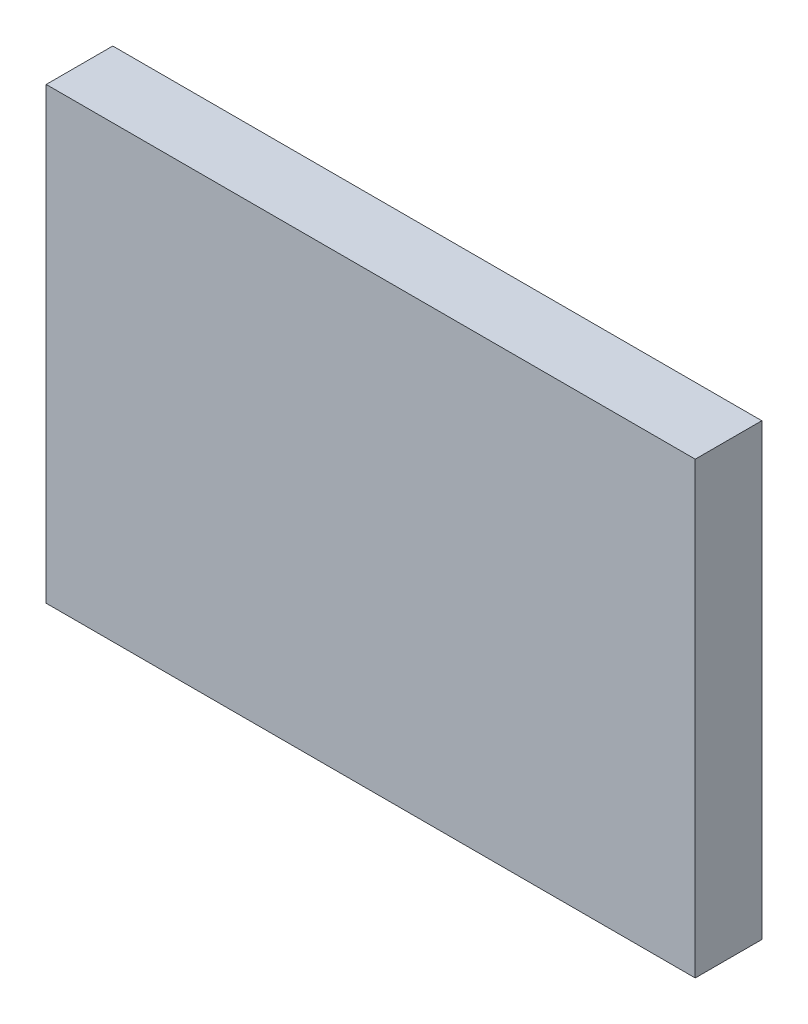
ISO-10303-21;
HEADER;
FILE_DESCRIPTION(('STEP AP214'),'2;1');
FILE_NAME('part.step','',(''),(''),'','','');
FILE_SCHEMA(('AUTOMOTIVE_DESIGN { 1 0 10303 214 1 1 1 1 }'));
ENDSEC;
DATA;
#1=APPLICATION_CONTEXT('core data for automotive mechanical design processes');
#2=APPLICATION_PROTOCOL_DEFINITION('international standard','automotive_design',2000,#1);
#3=PRODUCT_CONTEXT('',#1,'mechanical');
#4=PRODUCT('Part','Part','',(#3));
#5=PRODUCT_RELATED_PRODUCT_CATEGORY('part','',(#4));
#6=PRODUCT_DEFINITION_FORMATION('','',#4);
#7=PRODUCT_DEFINITION_CONTEXT('part definition',#1,'design');
#8=PRODUCT_DEFINITION('design','',#6,#7);
#9=PRODUCT_DEFINITION_SHAPE('','',#8);
#10=(LENGTH_UNIT() NAMED_UNIT(*) SI_UNIT(.MILLI.,.METRE.));
#11=(NAMED_UNIT(*) PLANE_ANGLE_UNIT() SI_UNIT($,.RADIAN.));
#12=(NAMED_UNIT(*) SI_UNIT($,.STERADIAN.) SOLID_ANGLE_UNIT());
#13=UNCERTAINTY_MEASURE_WITH_UNIT(LENGTH_MEASURE(1.E-05),#10,'distance_accuracy_value','');
#14=(GEOMETRIC_REPRESENTATION_CONTEXT(3) GLOBAL_UNCERTAINTY_ASSIGNED_CONTEXT((#13)) GLOBAL_UNIT_ASSIGNED_CONTEXT((#10,
#11,#12)) REPRESENTATION_CONTEXT('',''));
#15=CARTESIAN_POINT('',(0.,0.,0.));
#16=DIRECTION('',(0.,0.,1.));
#17=DIRECTION('',(1.,0.,0.));
#18=AXIS2_PLACEMENT_3D('',#15,#16,#17);
#19=CARTESIAN_POINT('',(-195.,-135.,40.));
#20=DIRECTION('',(1.,0.,0.));
#21=DIRECTION('',(0.,0.,-1.));
#22=AXIS2_PLACEMENT_3D('',#19,#20,#21);
#23=PLANE('',#22);
#24=DIRECTION('',(0.,-1.,0.));
#25=VECTOR('',#24,1.);
#26=CARTESIAN_POINT('',(-195.,-135.,0.));
#27=LINE('',#26,#25);
#28=CARTESIAN_POINT('',(-195.,135.,0.));
#29=VERTEX_POINT('',#28);
#30=CARTESIAN_POINT('',(-195.,-135.,0.));
#31=VERTEX_POINT('',#30);
#32=EDGE_CURVE('E96',#29,#31,#27,.T.);
#33=ORIENTED_EDGE('',*,*,#32,.T.);
#34=DIRECTION('',(0.,0.,-1.));
#35=VECTOR('',#34,1.);
#36=CARTESIAN_POINT('',(-195.,-135.,40.));
#37=LINE('',#36,#35);
#38=CARTESIAN_POINT('',(-195.,-135.,40.));
#39=VERTEX_POINT('',#38);
#40=EDGE_CURVE('E11',#39,#31,#37,.T.);
#41=ORIENTED_EDGE('',*,*,#40,.F.);
#42=DIRECTION('',(0.,-1.,0.));
#43=VECTOR('',#42,1.);
#44=CARTESIAN_POINT('',(-195.,-135.,40.));
#45=LINE('',#44,#43);
#46=CARTESIAN_POINT('',(-195.,135.,40.));
#47=VERTEX_POINT('',#46);
#48=EDGE_CURVE('E84',#47,#39,#45,.T.);
#49=ORIENTED_EDGE('',*,*,#48,.F.);
#50=DIRECTION('',(0.,0.,-1.));
#51=VECTOR('',#50,1.);
#52=CARTESIAN_POINT('',(-195.,135.,40.));
#53=LINE('',#52,#51);
#54=EDGE_CURVE('E92',#47,#29,#53,.T.);
#55=ORIENTED_EDGE('',*,*,#54,.T.);
#56=EDGE_LOOP('',(#33,#41,#49,#55));
#57=FACE_BOUND('',#56,.T.);
#58=ADVANCED_FACE('F33',(#57),#23,.F.);
#59=CARTESIAN_POINT('',(195.,-135.,40.));
#60=DIRECTION('',(0.,1.,0.));
#61=DIRECTION('',(-1.,0.,0.));
#62=AXIS2_PLACEMENT_3D('',#59,#60,#61);
#63=PLANE('',#62);
#64=DIRECTION('',(1.,0.,0.));
#65=VECTOR('',#64,1.);
#66=CARTESIAN_POINT('',(195.,-135.,0.));
#67=LINE('',#66,#65);
#68=CARTESIAN_POINT('',(195.,-135.,0.));
#69=VERTEX_POINT('',#68);
#70=EDGE_CURVE('E88',#31,#69,#67,.T.);
#71=ORIENTED_EDGE('',*,*,#70,.T.);
#72=DIRECTION('',(0.,0.,-1.));
#73=VECTOR('',#72,1.);
#74=CARTESIAN_POINT('',(195.,-135.,40.));
#75=LINE('',#74,#73);
#76=CARTESIAN_POINT('',(195.,-135.,40.));
#77=VERTEX_POINT('',#76);
#78=EDGE_CURVE('E41',#77,#69,#75,.T.);
#79=ORIENTED_EDGE('',*,*,#78,.F.);
#80=DIRECTION('',(1.,0.,0.));
#81=VECTOR('',#80,1.);
#82=CARTESIAN_POINT('',(195.,-135.,40.));
#83=LINE('',#82,#81);
#84=EDGE_CURVE('E79',#39,#77,#83,.T.);
#85=ORIENTED_EDGE('',*,*,#84,.F.);
#86=ORIENTED_EDGE('',*,*,#40,.T.);
#87=EDGE_LOOP('',(#71,#79,#85,#86));
#88=FACE_BOUND('',#87,.T.);
#89=ADVANCED_FACE('F87',(#88),#63,.F.);
#90=CARTESIAN_POINT('',(195.,-135.,40.));
#91=DIRECTION('',(-1.,0.,0.));
#92=DIRECTION('',(0.,0.,1.));
#93=AXIS2_PLACEMENT_3D('',#90,#91,#92);
#94=PLANE('',#93);
#95=DIRECTION('',(0.,1.,0.));
#96=VECTOR('',#95,1.);
#97=CARTESIAN_POINT('',(195.,-135.,0.));
#98=LINE('',#97,#96);
#99=CARTESIAN_POINT('',(195.,135.,0.));
#100=VERTEX_POINT('',#99);
#101=EDGE_CURVE('E66',#69,#100,#98,.T.);
#102=ORIENTED_EDGE('',*,*,#101,.T.);
#103=DIRECTION('',(0.,0.,-1.));
#104=VECTOR('',#103,1.);
#105=CARTESIAN_POINT('',(195.,135.,40.));
#106=LINE('',#105,#104);
#107=CARTESIAN_POINT('',(195.,135.,40.));
#108=VERTEX_POINT('',#107);
#109=EDGE_CURVE('E89',#108,#100,#106,.T.);
#110=ORIENTED_EDGE('',*,*,#109,.F.);
#111=DIRECTION('',(0.,1.,0.));
#112=VECTOR('',#111,1.);
#113=CARTESIAN_POINT('',(195.,-135.,40.));
#114=LINE('',#113,#112);
#115=EDGE_CURVE('E82',#77,#108,#114,.T.);
#116=ORIENTED_EDGE('',*,*,#115,.F.);
#117=ORIENTED_EDGE('',*,*,#78,.T.);
#118=EDGE_LOOP('',(#102,#110,#116,#117));
#119=FACE_BOUND('',#118,.T.);
#120=ADVANCED_FACE('F90',(#119),#94,.F.);
#121=CARTESIAN_POINT('',(195.,135.,40.));
#122=DIRECTION('',(0.,-1.,0.));
#123=DIRECTION('',(1.,0.,0.));
#124=AXIS2_PLACEMENT_3D('',#121,#122,#123);
#125=PLANE('',#124);
#126=DIRECTION('',(-1.,0.,0.));
#127=VECTOR('',#126,1.);
#128=CARTESIAN_POINT('',(195.,135.,0.));
#129=LINE('',#128,#127);
#130=EDGE_CURVE('E72',#100,#29,#129,.T.);
#131=ORIENTED_EDGE('',*,*,#130,.T.);
#132=ORIENTED_EDGE('',*,*,#54,.F.);
#133=DIRECTION('',(-1.,0.,0.));
#134=VECTOR('',#133,1.);
#135=CARTESIAN_POINT('',(195.,135.,40.));
#136=LINE('',#135,#134);
#137=EDGE_CURVE('E49',#108,#47,#136,.T.);
#138=ORIENTED_EDGE('',*,*,#137,.F.);
#139=ORIENTED_EDGE('',*,*,#109,.T.);
#140=EDGE_LOOP('',(#131,#132,#138,#139));
#141=FACE_BOUND('',#140,.T.);
#142=ADVANCED_FACE('F103',(#141),#125,.F.);
#143=CARTESIAN_POINT('',(0.,0.,40.));
#144=DIRECTION('',(0.,0.,1.));
#145=DIRECTION('',(1.,0.,0.));
#146=AXIS2_PLACEMENT_3D('',#143,#144,#145);
#147=PLANE('',#146);
#148=ORIENTED_EDGE('',*,*,#48,.T.);
#149=ORIENTED_EDGE('',*,*,#84,.T.);
#150=ORIENTED_EDGE('',*,*,#115,.T.);
#151=ORIENTED_EDGE('',*,*,#137,.T.);
#152=EDGE_LOOP('',(#148,#149,#150,#151));
#153=FACE_BOUND('',#152,.T.);
#154=ADVANCED_FACE('F80',(#153),#147,.T.);
#155=CARTESIAN_POINT('',(0.,0.,0.));
#156=DIRECTION('',(0.,0.,1.));
#157=DIRECTION('',(1.,0.,0.));
#158=AXIS2_PLACEMENT_3D('',#155,#156,#157);
#159=PLANE('',#158);
#160=ORIENTED_EDGE('',*,*,#32,.F.);
#161=ORIENTED_EDGE('',*,*,#130,.F.);
#162=ORIENTED_EDGE('',*,*,#101,.F.);
#163=ORIENTED_EDGE('',*,*,#70,.F.);
#164=EDGE_LOOP('',(#160,#161,#162,#163));
#165=FACE_BOUND('',#164,.T.);
#166=ADVANCED_FACE('F106',(#165),#159,.F.);
#167=CLOSED_SHELL('',(#58,#89,#120,#142,#154,#166));
#168=MANIFOLD_SOLID_BREP('B2',#167);
#169=ADVANCED_BREP_SHAPE_REPRESENTATION('',(#18,#168),#14);
#170=SHAPE_DEFINITION_REPRESENTATION(#9,#169);
ENDSEC;
END-ISO-10303-21;
